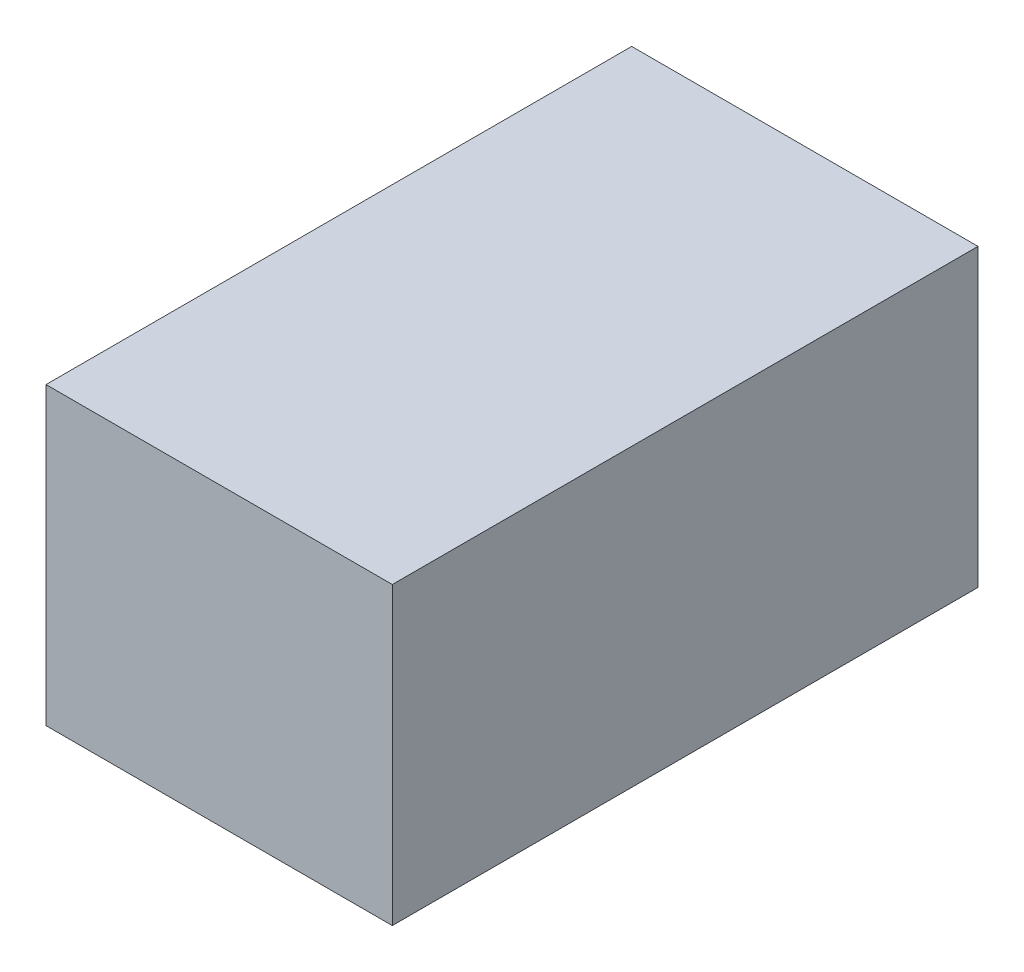
ISO-10303-21;
HEADER;
FILE_DESCRIPTION(('STEP AP214'),'2;1');
FILE_NAME('part.step','',(''),(''),'','','');
FILE_SCHEMA(('AUTOMOTIVE_DESIGN { 1 0 10303 214 1 1 1 1 }'));
ENDSEC;
DATA;
#1=APPLICATION_CONTEXT('core data for automotive mechanical design processes');
#2=APPLICATION_PROTOCOL_DEFINITION('international standard','automotive_design',2000,#1);
#3=PRODUCT_CONTEXT('',#1,'mechanical');
#4=PRODUCT('Part','Part','',(#3));
#5=PRODUCT_RELATED_PRODUCT_CATEGORY('part','',(#4));
#6=PRODUCT_DEFINITION_FORMATION('','',#4);
#7=PRODUCT_DEFINITION_CONTEXT('part definition',#1,'design');
#8=PRODUCT_DEFINITION('design','',#6,#7);
#9=PRODUCT_DEFINITION_SHAPE('','',#8);
#10=(LENGTH_UNIT() NAMED_UNIT(*) SI_UNIT(.MILLI.,.METRE.));
#11=(NAMED_UNIT(*) PLANE_ANGLE_UNIT() SI_UNIT($,.RADIAN.));
#12=(NAMED_UNIT(*) SI_UNIT($,.STERADIAN.) SOLID_ANGLE_UNIT());
#13=UNCERTAINTY_MEASURE_WITH_UNIT(LENGTH_MEASURE(1.E-05),#10,'distance_accuracy_value','');
#14=(GEOMETRIC_REPRESENTATION_CONTEXT(3) GLOBAL_UNCERTAINTY_ASSIGNED_CONTEXT((#13)) GLOBAL_UNIT_ASSIGNED_CONTEXT((#10,
#11,#12)) REPRESENTATION_CONTEXT('',''));
#15=CARTESIAN_POINT('',(0.,0.,0.));
#16=DIRECTION('',(0.,0.,1.));
#17=DIRECTION('',(1.,0.,0.));
#18=AXIS2_PLACEMENT_3D('',#15,#16,#17);
#19=CARTESIAN_POINT('',(34.,58.,-57.5));
#20=DIRECTION('',(-1.,0.,0.));
#21=DIRECTION('',(0.,0.,1.));
#22=AXIS2_PLACEMENT_3D('',#19,#20,#21);
#23=PLANE('',#22);
#24=DIRECTION('',(0.,0.,-1.));
#25=VECTOR('',#24,1.);
#26=CARTESIAN_POINT('',(34.,0.,-57.5));
#27=LINE('',#26,#25);
#28=CARTESIAN_POINT('',(34.,0.,57.5));
#29=VERTEX_POINT('',#28);
#30=CARTESIAN_POINT('',(34.,0.,-57.5));
#31=VERTEX_POINT('',#30);
#32=EDGE_CURVE('E97',#29,#31,#27,.T.);
#33=ORIENTED_EDGE('',*,*,#32,.T.);
#34=DIRECTION('',(0.,-1.,0.));
#35=VECTOR('',#34,1.);
#36=CARTESIAN_POINT('',(34.,58.,-57.5));
#37=LINE('',#36,#35);
#38=CARTESIAN_POINT('',(34.,58.,-57.5));
#39=VERTEX_POINT('',#38);
#40=EDGE_CURVE('E11',#39,#31,#37,.T.);
#41=ORIENTED_EDGE('',*,*,#40,.F.);
#42=DIRECTION('',(0.,0.,-1.));
#43=VECTOR('',#42,1.);
#44=CARTESIAN_POINT('',(34.,58.,-57.5));
#45=LINE('',#44,#43);
#46=CARTESIAN_POINT('',(34.,58.,57.5));
#47=VERTEX_POINT('',#46);
#48=EDGE_CURVE('E85',#47,#39,#45,.T.);
#49=ORIENTED_EDGE('',*,*,#48,.F.);
#50=DIRECTION('',(0.,-1.,0.));
#51=VECTOR('',#50,1.);
#52=CARTESIAN_POINT('',(34.,58.,57.5));
#53=LINE('',#52,#51);
#54=EDGE_CURVE('E93',#47,#29,#53,.T.);
#55=ORIENTED_EDGE('',*,*,#54,.T.);
#56=EDGE_LOOP('',(#33,#41,#49,#55));
#57=FACE_BOUND('',#56,.T.);
#58=ADVANCED_FACE('F34',(#57),#23,.F.);
#59=CARTESIAN_POINT('',(-34.,58.,-57.5));
#60=DIRECTION('',(0.,0.,1.));
#61=DIRECTION('',(1.,0.,0.));
#62=AXIS2_PLACEMENT_3D('',#59,#60,#61);
#63=PLANE('',#62);
#64=DIRECTION('',(-1.,0.,0.));
#65=VECTOR('',#64,1.);
#66=CARTESIAN_POINT('',(-34.,0.,-57.5));
#67=LINE('',#66,#65);
#68=CARTESIAN_POINT('',(-34.,0.,-57.5));
#69=VERTEX_POINT('',#68);
#70=EDGE_CURVE('E89',#31,#69,#67,.T.);
#71=ORIENTED_EDGE('',*,*,#70,.T.);
#72=DIRECTION('',(0.,-1.,0.));
#73=VECTOR('',#72,1.);
#74=CARTESIAN_POINT('',(-34.,58.,-57.5));
#75=LINE('',#74,#73);
#76=CARTESIAN_POINT('',(-34.,58.,-57.5));
#77=VERTEX_POINT('',#76);
#78=EDGE_CURVE('E42',#77,#69,#75,.T.);
#79=ORIENTED_EDGE('',*,*,#78,.F.);
#80=DIRECTION('',(-1.,0.,0.));
#81=VECTOR('',#80,1.);
#82=CARTESIAN_POINT('',(-34.,58.,-57.5));
#83=LINE('',#82,#81);
#84=EDGE_CURVE('E80',#39,#77,#83,.T.);
#85=ORIENTED_EDGE('',*,*,#84,.F.);
#86=ORIENTED_EDGE('',*,*,#40,.T.);
#87=EDGE_LOOP('',(#71,#79,#85,#86));
#88=FACE_BOUND('',#87,.T.);
#89=ADVANCED_FACE('F88',(#88),#63,.F.);
#90=CARTESIAN_POINT('',(-34.,58.,-57.5));
#91=DIRECTION('',(1.,0.,0.));
#92=DIRECTION('',(0.,0.,-1.));
#93=AXIS2_PLACEMENT_3D('',#90,#91,#92);
#94=PLANE('',#93);
#95=DIRECTION('',(0.,0.,1.));
#96=VECTOR('',#95,1.);
#97=CARTESIAN_POINT('',(-34.,0.,-57.5));
#98=LINE('',#97,#96);
#99=CARTESIAN_POINT('',(-34.,0.,57.5));
#100=VERTEX_POINT('',#99);
#101=EDGE_CURVE('E67',#69,#100,#98,.T.);
#102=ORIENTED_EDGE('',*,*,#101,.T.);
#103=DIRECTION('',(0.,-1.,0.));
#104=VECTOR('',#103,1.);
#105=CARTESIAN_POINT('',(-34.,58.,57.5));
#106=LINE('',#105,#104);
#107=CARTESIAN_POINT('',(-34.,58.,57.5));
#108=VERTEX_POINT('',#107);
#109=EDGE_CURVE('E90',#108,#100,#106,.T.);
#110=ORIENTED_EDGE('',*,*,#109,.F.);
#111=DIRECTION('',(0.,0.,1.));
#112=VECTOR('',#111,1.);
#113=CARTESIAN_POINT('',(-34.,58.,-57.5));
#114=LINE('',#113,#112);
#115=EDGE_CURVE('E83',#77,#108,#114,.T.);
#116=ORIENTED_EDGE('',*,*,#115,.F.);
#117=ORIENTED_EDGE('',*,*,#78,.T.);
#118=EDGE_LOOP('',(#102,#110,#116,#117));
#119=FACE_BOUND('',#118,.T.);
#120=ADVANCED_FACE('F91',(#119),#94,.F.);
#121=CARTESIAN_POINT('',(-34.,58.,57.5));
#122=DIRECTION('',(0.,0.,-1.));
#123=DIRECTION('',(-1.,0.,0.));
#124=AXIS2_PLACEMENT_3D('',#121,#122,#123);
#125=PLANE('',#124);
#126=DIRECTION('',(1.,0.,0.));
#127=VECTOR('',#126,1.);
#128=CARTESIAN_POINT('',(-34.,0.,57.5));
#129=LINE('',#128,#127);
#130=EDGE_CURVE('E73',#100,#29,#129,.T.);
#131=ORIENTED_EDGE('',*,*,#130,.T.);
#132=ORIENTED_EDGE('',*,*,#54,.F.);
#133=DIRECTION('',(1.,0.,0.));
#134=VECTOR('',#133,1.);
#135=CARTESIAN_POINT('',(-34.,58.,57.5));
#136=LINE('',#135,#134);
#137=EDGE_CURVE('E50',#108,#47,#136,.T.);
#138=ORIENTED_EDGE('',*,*,#137,.F.);
#139=ORIENTED_EDGE('',*,*,#109,.T.);
#140=EDGE_LOOP('',(#131,#132,#138,#139));
#141=FACE_BOUND('',#140,.T.);
#142=ADVANCED_FACE('F104',(#141),#125,.F.);
#143=CARTESIAN_POINT('',(0.,58.,0.));
#144=DIRECTION('',(0.,1.,0.));
#145=DIRECTION('',(0.,0.,1.));
#146=AXIS2_PLACEMENT_3D('',#143,#144,#145);
#147=PLANE('',#146);
#148=ORIENTED_EDGE('',*,*,#48,.T.);
#149=ORIENTED_EDGE('',*,*,#84,.T.);
#150=ORIENTED_EDGE('',*,*,#115,.T.);
#151=ORIENTED_EDGE('',*,*,#137,.T.);
#152=EDGE_LOOP('',(#148,#149,#150,#151));
#153=FACE_BOUND('',#152,.T.);
#154=ADVANCED_FACE('F81',(#153),#147,.T.);
#155=CARTESIAN_POINT('',(0.,0.,0.));
#156=DIRECTION('',(0.,1.,0.));
#157=DIRECTION('',(0.,0.,1.));
#158=AXIS2_PLACEMENT_3D('',#155,#156,#157);
#159=PLANE('',#158);
#160=ORIENTED_EDGE('',*,*,#32,.F.);
#161=ORIENTED_EDGE('',*,*,#130,.F.);
#162=ORIENTED_EDGE('',*,*,#101,.F.);
#163=ORIENTED_EDGE('',*,*,#70,.F.);
#164=EDGE_LOOP('',(#160,#161,#162,#163));
#165=FACE_BOUND('',#164,.T.);
#166=ADVANCED_FACE('F107',(#165),#159,.F.);
#167=CLOSED_SHELL('',(#58,#89,#120,#142,#154,#166));
#168=MANIFOLD_SOLID_BREP('B2',#167);
#169=ADVANCED_BREP_SHAPE_REPRESENTATION('',(#18,#168),#14);
#170=SHAPE_DEFINITION_REPRESENTATION(#9,#169);
ENDSEC;
END-ISO-10303-21;
